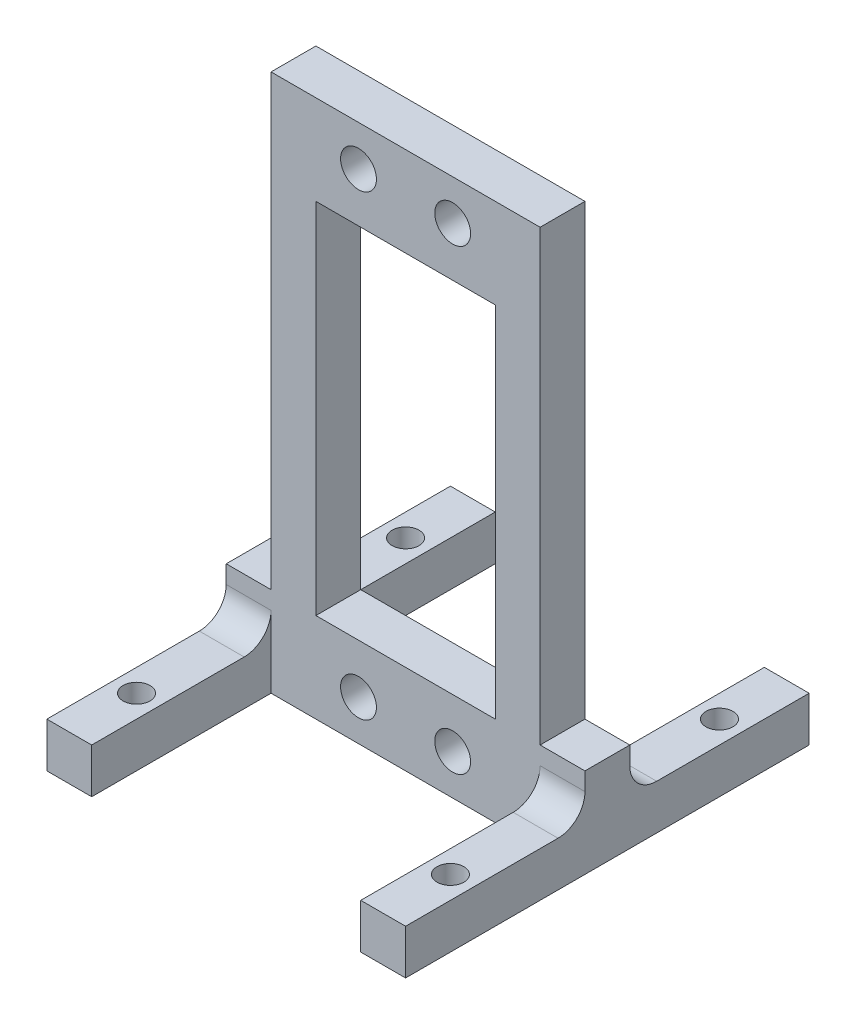
ISO-10303-21;
HEADER;
FILE_DESCRIPTION(('STEP AP214'),'2;1');
FILE_NAME('part.step','',(''),(''),'','','');
FILE_SCHEMA(('AUTOMOTIVE_DESIGN { 1 0 10303 214 1 1 1 1 }'));
ENDSEC;
DATA;
#1=APPLICATION_CONTEXT('core data for automotive mechanical design processes');
#2=APPLICATION_PROTOCOL_DEFINITION('international standard','automotive_design',2000,#1);
#3=PRODUCT_CONTEXT('',#1,'mechanical');
#4=PRODUCT('Part','Part','',(#3));
#5=PRODUCT_RELATED_PRODUCT_CATEGORY('part','',(#4));
#6=PRODUCT_DEFINITION_FORMATION('','',#4);
#7=PRODUCT_DEFINITION_CONTEXT('part definition',#1,'design');
#8=PRODUCT_DEFINITION('design','',#6,#7);
#9=PRODUCT_DEFINITION_SHAPE('','',#8);
#10=(LENGTH_UNIT() NAMED_UNIT(*) SI_UNIT(.MILLI.,.METRE.));
#11=(NAMED_UNIT(*) PLANE_ANGLE_UNIT() SI_UNIT($,.RADIAN.));
#12=(NAMED_UNIT(*) SI_UNIT($,.STERADIAN.) SOLID_ANGLE_UNIT());
#13=UNCERTAINTY_MEASURE_WITH_UNIT(LENGTH_MEASURE(1.E-05),#10,'distance_accuracy_value','');
#14=(GEOMETRIC_REPRESENTATION_CONTEXT(3) GLOBAL_UNCERTAINTY_ASSIGNED_CONTEXT((#13)) GLOBAL_UNIT_ASSIGNED_CONTEXT((#10,
#11,#12)) REPRESENTATION_CONTEXT('',''));
#15=CARTESIAN_POINT('',(0.,0.,0.));
#16=DIRECTION('',(0.,0.,1.));
#17=DIRECTION('',(1.,0.,0.));
#18=AXIS2_PLACEMENT_3D('',#15,#16,#17);
#19=CARTESIAN_POINT('',(25.,-50.,5.));
#20=DIRECTION('',(0.,1.,0.));
#21=DIRECTION('',(-1.,0.,0.));
#22=AXIS2_PLACEMENT_3D('',#19,#20,#21);
#23=PLANE('',#22);
#24=CARTESIAN_POINT('',(27.5,-50.,17.5));
#25=DIRECTION('',(0.,1.,0.));
#26=DIRECTION('',(0.,0.,1.));
#27=AXIS2_PLACEMENT_3D('',#24,#25,#26);
#28=CIRCLE('',#27,1.5);
#29=CARTESIAN_POINT('',(27.5,-50.,19.));
#30=VERTEX_POINT('',#29);
#31=EDGE_CURVE('E811',#30,#30,#28,.T.);
#32=ORIENTED_EDGE('',*,*,#31,.T.);
#33=EDGE_LOOP('',(#32));
#34=FACE_BOUND('',#33,.T.);
#35=CARTESIAN_POINT('',(27.5,-50.,-12.5));
#36=DIRECTION('',(0.,1.,0.));
#37=DIRECTION('',(0.,0.,1.));
#38=AXIS2_PLACEMENT_3D('',#35,#36,#37);
#39=CIRCLE('',#38,1.5);
#40=CARTESIAN_POINT('',(27.5,-50.,-11.));
#41=VERTEX_POINT('',#40);
#42=EDGE_CURVE('E279',#41,#41,#39,.F.);
#43=ORIENTED_EDGE('',*,*,#42,.F.);
#44=EDGE_LOOP('',(#43));
#45=FACE_BOUND('',#44,.T.);
#46=DIRECTION('',(1.,0.,0.));
#47=VECTOR('',#46,1.);
#48=CARTESIAN_POINT('',(25.,-50.,0.));
#49=LINE('',#48,#47);
#50=CARTESIAN_POINT('',(-5.,-50.,0.));
#51=VERTEX_POINT('',#50);
#52=CARTESIAN_POINT('',(25.,-50.,0.));
#53=VERTEX_POINT('',#52);
#54=EDGE_CURVE('E452',#51,#53,#49,.T.);
#55=ORIENTED_EDGE('',*,*,#54,.T.);
#56=DIRECTION('',(0.,0.,-1.));
#57=VECTOR('',#56,1.);
#58=CARTESIAN_POINT('',(25.,-50.,0.));
#59=LINE('',#58,#57);
#60=CARTESIAN_POINT('',(25.,-50.,-20.));
#61=VERTEX_POINT('',#60);
#62=EDGE_CURVE('E237',#53,#61,#59,.T.);
#63=ORIENTED_EDGE('',*,*,#62,.T.);
#64=DIRECTION('',(-1.,0.,0.));
#65=VECTOR('',#64,1.);
#66=CARTESIAN_POINT('',(30.,-50.,-20.));
#67=LINE('',#66,#65);
#68=CARTESIAN_POINT('',(30.,-50.,-20.));
#69=VERTEX_POINT('',#68);
#70=EDGE_CURVE('E380',#69,#61,#67,.T.);
#71=ORIENTED_EDGE('',*,*,#70,.F.);
#72=DIRECTION('',(0.,0.,-1.));
#73=VECTOR('',#72,1.);
#74=CARTESIAN_POINT('',(30.,-50.,5.));
#75=LINE('',#74,#73);
#76=CARTESIAN_POINT('',(30.,-50.,25.));
#77=VERTEX_POINT('',#76);
#78=EDGE_CURVE('E314',#77,#69,#75,.T.);
#79=ORIENTED_EDGE('',*,*,#78,.F.);
#80=DIRECTION('',(-1.,0.,0.));
#81=VECTOR('',#80,1.);
#82=CARTESIAN_POINT('',(30.,-50.,25.));
#83=LINE('',#82,#81);
#84=CARTESIAN_POINT('',(25.,-50.,25.));
#85=VERTEX_POINT('',#84);
#86=EDGE_CURVE('E335',#77,#85,#83,.T.);
#87=ORIENTED_EDGE('',*,*,#86,.T.);
#88=CARTESIAN_POINT('',(25.,-50.,5.));
#89=VERTEX_POINT('',#88);
#90=EDGE_CURVE('E336',#85,#89,#59,.T.);
#91=ORIENTED_EDGE('',*,*,#90,.T.);
#92=DIRECTION('',(1.,0.,0.));
#93=VECTOR('',#92,1.);
#94=CARTESIAN_POINT('',(25.,-50.,5.));
#95=LINE('',#94,#93);
#96=CARTESIAN_POINT('',(-5.,-50.,5.));
#97=VERTEX_POINT('',#96);
#98=EDGE_CURVE('E442',#97,#89,#95,.T.);
#99=ORIENTED_EDGE('',*,*,#98,.F.);
#100=DIRECTION('',(0.,0.,-1.));
#101=VECTOR('',#100,1.);
#102=CARTESIAN_POINT('',(-5.,-50.,5.));
#103=LINE('',#102,#101);
#104=CARTESIAN_POINT('',(-5.,-50.,25.));
#105=VERTEX_POINT('',#104);
#106=EDGE_CURVE('E232',#105,#97,#103,.T.);
#107=ORIENTED_EDGE('',*,*,#106,.F.);
#108=DIRECTION('',(1.,0.,0.));
#109=VECTOR('',#108,1.);
#110=CARTESIAN_POINT('',(-10.,-50.,25.));
#111=LINE('',#110,#109);
#112=CARTESIAN_POINT('',(-10.,-50.,25.));
#113=VERTEX_POINT('',#112);
#114=EDGE_CURVE('E225',#113,#105,#111,.T.);
#115=ORIENTED_EDGE('',*,*,#114,.F.);
#116=DIRECTION('',(0.,0.,-1.));
#117=VECTOR('',#116,1.);
#118=CARTESIAN_POINT('',(-10.,-50.,5.));
#119=LINE('',#118,#117);
#120=CARTESIAN_POINT('',(-10.,-50.,-20.));
#121=VERTEX_POINT('',#120);
#122=EDGE_CURVE('E229',#113,#121,#119,.T.);
#123=ORIENTED_EDGE('',*,*,#122,.T.);
#124=DIRECTION('',(1.,0.,0.));
#125=VECTOR('',#124,1.);
#126=CARTESIAN_POINT('',(-10.,-50.,-20.));
#127=LINE('',#126,#125);
#128=CARTESIAN_POINT('',(-5.,-50.,-20.));
#129=VERTEX_POINT('',#128);
#130=EDGE_CURVE('E275',#121,#129,#127,.T.);
#131=ORIENTED_EDGE('',*,*,#130,.T.);
#132=EDGE_CURVE('E296',#51,#129,#103,.T.);
#133=ORIENTED_EDGE('',*,*,#132,.F.);
#134=EDGE_LOOP('',(#55,#63,#71,#79,#87,#91,#99,#107,#115,#123,#131,#133));
#135=FACE_BOUND('',#134,.T.);
#136=CARTESIAN_POINT('',(-7.5,-50.,17.5));
#137=DIRECTION('',(0.,1.,0.));
#138=DIRECTION('',(0.,0.,1.));
#139=AXIS2_PLACEMENT_3D('',#136,#137,#138);
#140=CIRCLE('',#139,1.5);
#141=CARTESIAN_POINT('',(-7.5,-50.,19.));
#142=VERTEX_POINT('',#141);
#143=EDGE_CURVE('E820',#142,#142,#140,.F.);
#144=ORIENTED_EDGE('',*,*,#143,.F.);
#145=EDGE_LOOP('',(#144));
#146=FACE_BOUND('',#145,.T.);
#147=CARTESIAN_POINT('',(-7.5,-50.,-12.5));
#148=DIRECTION('',(0.,1.,0.));
#149=DIRECTION('',(0.,0.,1.));
#150=AXIS2_PLACEMENT_3D('',#147,#148,#149);
#151=CIRCLE('',#150,1.5);
#152=CARTESIAN_POINT('',(-7.5,-50.,-11.));
#153=VERTEX_POINT('',#152);
#154=EDGE_CURVE('E814',#153,#153,#151,.T.);
#155=ORIENTED_EDGE('',*,*,#154,.T.);
#156=EDGE_LOOP('',(#155));
#157=FACE_BOUND('',#156,.T.);
#158=ADVANCED_FACE('F39',(#34,#45,#135,#146,#157),#23,.F.);
#159=CARTESIAN_POINT('',(-5.,-50.,5.));
#160=DIRECTION('',(1.,0.,0.));
#161=DIRECTION('',(0.,0.,-1.));
#162=AXIS2_PLACEMENT_3D('',#159,#160,#161);
#163=PLANE('',#162);
#164=DIRECTION('',(0.,-1.,0.));
#165=VECTOR('',#164,1.);
#166=CARTESIAN_POINT('',(-5.,-50.,0.));
#167=LINE('',#166,#165);
#168=CARTESIAN_POINT('',(-5.,10.,0.));
#169=VERTEX_POINT('',#168);
#170=CARTESIAN_POINT('',(-5.,-40.,0.));
#171=VERTEX_POINT('',#170);
#172=EDGE_CURVE('E449',#169,#171,#167,.T.);
#173=ORIENTED_EDGE('',*,*,#172,.T.);
#174=DIRECTION('',(0.,0.,1.));
#175=VECTOR('',#174,1.);
#176=CARTESIAN_POINT('',(-5.,-40.,5.));
#177=LINE('',#176,#175);
#178=CARTESIAN_POINT('',(-5.,-40.,5.));
#179=VERTEX_POINT('',#178);
#180=EDGE_CURVE('E285',#171,#179,#177,.T.);
#181=ORIENTED_EDGE('',*,*,#180,.T.);
#182=DIRECTION('',(0.,-1.,0.));
#183=VECTOR('',#182,1.);
#184=CARTESIAN_POINT('',(-5.,-50.,5.));
#185=LINE('',#184,#183);
#186=CARTESIAN_POINT('',(-5.,10.,5.));
#187=VERTEX_POINT('',#186);
#188=EDGE_CURVE('E439',#187,#179,#185,.T.);
#189=ORIENTED_EDGE('',*,*,#188,.F.);
#190=DIRECTION('',(0.,0.,-1.));
#191=VECTOR('',#190,1.);
#192=CARTESIAN_POINT('',(-5.,10.,5.));
#193=LINE('',#192,#191);
#194=EDGE_CURVE('E47',#187,#169,#193,.T.);
#195=ORIENTED_EDGE('',*,*,#194,.T.);
#196=EDGE_LOOP('',(#173,#181,#189,#195));
#197=FACE_BOUND('',#196,.T.);
#198=ADVANCED_FACE('F41',(#197),#163,.F.);
#199=CARTESIAN_POINT('',(25.,10.,5.));
#200=DIRECTION('',(-1.,0.,0.));
#201=DIRECTION('',(0.,0.,1.));
#202=AXIS2_PLACEMENT_3D('',#199,#200,#201);
#203=PLANE('',#202);
#204=DIRECTION('',(0.,0.,1.));
#205=VECTOR('',#204,1.);
#206=CARTESIAN_POINT('',(25.,-40.,5.));
#207=LINE('',#206,#205);
#208=CARTESIAN_POINT('',(25.,-40.,0.));
#209=VERTEX_POINT('',#208);
#210=CARTESIAN_POINT('',(25.,-40.,5.));
#211=VERTEX_POINT('',#210);
#212=EDGE_CURVE('E346',#209,#211,#207,.T.);
#213=ORIENTED_EDGE('',*,*,#212,.F.);
#214=DIRECTION('',(0.,1.,0.));
#215=VECTOR('',#214,1.);
#216=CARTESIAN_POINT('',(25.,10.,0.));
#217=LINE('',#216,#215);
#218=CARTESIAN_POINT('',(25.,10.,0.));
#219=VERTEX_POINT('',#218);
#220=EDGE_CURVE('E454',#209,#219,#217,.T.);
#221=ORIENTED_EDGE('',*,*,#220,.T.);
#222=DIRECTION('',(0.,0.,-1.));
#223=VECTOR('',#222,1.);
#224=CARTESIAN_POINT('',(25.,10.,5.));
#225=LINE('',#224,#223);
#226=CARTESIAN_POINT('',(25.,10.,5.));
#227=VERTEX_POINT('',#226);
#228=EDGE_CURVE('E12',#227,#219,#225,.T.);
#229=ORIENTED_EDGE('',*,*,#228,.F.);
#230=DIRECTION('',(0.,1.,0.));
#231=VECTOR('',#230,1.);
#232=CARTESIAN_POINT('',(25.,10.,5.));
#233=LINE('',#232,#231);
#234=EDGE_CURVE('E445',#211,#227,#233,.T.);
#235=ORIENTED_EDGE('',*,*,#234,.F.);
#236=EDGE_LOOP('',(#213,#221,#229,#235));
#237=FACE_BOUND('',#236,.T.);
#238=ADVANCED_FACE('F479',(#237),#203,.F.);
#239=CARTESIAN_POINT('',(0.,0.,5.));
#240=DIRECTION('',(0.,0.,-1.));
#241=DIRECTION('',(-1.,0.,0.));
#242=AXIS2_PLACEMENT_3D('',#239,#240,#241);
#243=PLANE('',#242);
#244=CARTESIAN_POINT('',(15.25,5.49999999999999,5.));
#245=DIRECTION('',(0.,0.,1.));
#246=DIRECTION('',(1.,0.,0.));
#247=AXIS2_PLACEMENT_3D('',#244,#245,#246);
#248=CIRCLE('',#247,2.);
#249=CARTESIAN_POINT('',(17.25,5.49999999999999,5.));
#250=VERTEX_POINT('',#249);
#251=EDGE_CURVE('E388',#250,#250,#248,.T.);
#252=ORIENTED_EDGE('',*,*,#251,.F.);
#253=EDGE_LOOP('',(#252));
#254=FACE_BOUND('',#253,.T.);
#255=CARTESIAN_POINT('',(4.75,5.5,5.));
#256=DIRECTION('',(0.,0.,1.));
#257=DIRECTION('',(1.,0.,0.));
#258=AXIS2_PLACEMENT_3D('',#255,#256,#257);
#259=CIRCLE('',#258,2.);
#260=CARTESIAN_POINT('',(6.75,5.5,5.));
#261=VERTEX_POINT('',#260);
#262=EDGE_CURVE('E387',#261,#261,#259,.F.);
#263=ORIENTED_EDGE('',*,*,#262,.T.);
#264=EDGE_LOOP('',(#263));
#265=FACE_BOUND('',#264,.T.);
#266=ORIENTED_EDGE('',*,*,#188,.T.);
#267=DIRECTION('',(1.,0.,0.));
#268=VECTOR('',#267,1.);
#269=CARTESIAN_POINT('',(-10.,-40.,5.));
#270=LINE('',#269,#268);
#271=CARTESIAN_POINT('',(-10.,-40.,5.));
#272=VERTEX_POINT('',#271);
#273=EDGE_CURVE('E54',#272,#179,#270,.T.);
#274=ORIENTED_EDGE('',*,*,#273,.F.);
#275=DIRECTION('',(0.,-1.,0.));
#276=VECTOR('',#275,1.);
#277=CARTESIAN_POINT('',(-10.,-42.,5.));
#278=LINE('',#277,#276);
#279=CARTESIAN_POINT('',(-10.,-42.,5.));
#280=VERTEX_POINT('',#279);
#281=EDGE_CURVE('E260',#272,#280,#278,.T.);
#282=ORIENTED_EDGE('',*,*,#281,.T.);
#283=DIRECTION('',(1.,0.,0.));
#284=VECTOR('',#283,1.);
#285=CARTESIAN_POINT('',(-10.,-42.,5.));
#286=LINE('',#285,#284);
#287=CARTESIAN_POINT('',(-5.,-42.,5.));
#288=VERTEX_POINT('',#287);
#289=EDGE_CURVE('E308',#280,#288,#286,.T.);
#290=ORIENTED_EDGE('',*,*,#289,.T.);
#291=EDGE_CURVE('E443',#288,#97,#185,.T.);
#292=ORIENTED_EDGE('',*,*,#291,.T.);
#293=ORIENTED_EDGE('',*,*,#98,.T.);
#294=CARTESIAN_POINT('',(25.,-42.,5.));
#295=VERTEX_POINT('',#294);
#296=EDGE_CURVE('E62',#89,#295,#233,.T.);
#297=ORIENTED_EDGE('',*,*,#296,.T.);
#298=DIRECTION('',(-1.,0.,0.));
#299=VECTOR('',#298,1.);
#300=CARTESIAN_POINT('',(30.,-42.,5.));
#301=LINE('',#300,#299);
#302=CARTESIAN_POINT('',(30.,-42.,5.));
#303=VERTEX_POINT('',#302);
#304=EDGE_CURVE('E363',#303,#295,#301,.T.);
#305=ORIENTED_EDGE('',*,*,#304,.F.);
#306=DIRECTION('',(0.,-1.,0.));
#307=VECTOR('',#306,1.);
#308=CARTESIAN_POINT('',(30.,-42.,5.));
#309=LINE('',#308,#307);
#310=CARTESIAN_POINT('',(30.,-40.,5.));
#311=VERTEX_POINT('',#310);
#312=EDGE_CURVE('E327',#311,#303,#309,.T.);
#313=ORIENTED_EDGE('',*,*,#312,.F.);
#314=DIRECTION('',(-1.,0.,0.));
#315=VECTOR('',#314,1.);
#316=CARTESIAN_POINT('',(30.,-40.,5.));
#317=LINE('',#316,#315);
#318=EDGE_CURVE('E365',#311,#211,#317,.T.);
#319=ORIENTED_EDGE('',*,*,#318,.T.);
#320=ORIENTED_EDGE('',*,*,#234,.T.);
#321=DIRECTION('',(-1.,0.,0.));
#322=VECTOR('',#321,1.);
#323=CARTESIAN_POINT('',(-5.,10.,5.));
#324=LINE('',#323,#322);
#325=EDGE_CURVE('E447',#227,#187,#324,.T.);
#326=ORIENTED_EDGE('',*,*,#325,.T.);
#327=EDGE_LOOP('',(#266,#274,#282,#290,#292,#293,#297,#305,#313,#319,#320,#326));
#328=FACE_BOUND('',#327,.T.);
#329=DIRECTION('',(0.,-1.,0.));
#330=VECTOR('',#329,1.);
#331=CARTESIAN_POINT('',(0.,0.,5.));
#332=LINE('',#331,#330);
#333=CARTESIAN_POINT('',(0.,0.,5.));
#334=VERTEX_POINT('',#333);
#335=CARTESIAN_POINT('',(0.,-40.,5.));
#336=VERTEX_POINT('',#335);
#337=EDGE_CURVE('E408',#334,#336,#332,.T.);
#338=ORIENTED_EDGE('',*,*,#337,.F.);
#339=DIRECTION('',(-1.,0.,0.));
#340=VECTOR('',#339,1.);
#341=CARTESIAN_POINT('',(0.,0.,5.));
#342=LINE('',#341,#340);
#343=CARTESIAN_POINT('',(20.,0.,5.));
#344=VERTEX_POINT('',#343);
#345=EDGE_CURVE('E416',#344,#334,#342,.T.);
#346=ORIENTED_EDGE('',*,*,#345,.F.);
#347=DIRECTION('',(0.,1.,0.));
#348=VECTOR('',#347,1.);
#349=CARTESIAN_POINT('',(20.,0.,5.));
#350=LINE('',#349,#348);
#351=CARTESIAN_POINT('',(20.,-40.,5.));
#352=VERTEX_POINT('',#351);
#353=EDGE_CURVE('E413',#352,#344,#350,.T.);
#354=ORIENTED_EDGE('',*,*,#353,.F.);
#355=DIRECTION('',(1.,0.,0.));
#356=VECTOR('',#355,1.);
#357=CARTESIAN_POINT('',(0.,-40.,5.));
#358=LINE('',#357,#356);
#359=EDGE_CURVE('E410',#336,#352,#358,.T.);
#360=ORIENTED_EDGE('',*,*,#359,.F.);
#361=EDGE_LOOP('',(#338,#346,#354,#360));
#362=FACE_BOUND('',#361,.T.);
#363=CARTESIAN_POINT('',(15.25,-45.5,5.));
#364=DIRECTION('',(0.,0.,1.));
#365=DIRECTION('',(1.,0.,0.));
#366=AXIS2_PLACEMENT_3D('',#363,#364,#365);
#367=CIRCLE('',#366,1.99999999999994);
#368=CARTESIAN_POINT('',(17.2499999999999,-45.5,5.));
#369=VERTEX_POINT('',#368);
#370=EDGE_CURVE('E394',#369,#369,#367,.F.);
#371=ORIENTED_EDGE('',*,*,#370,.T.);
#372=EDGE_LOOP('',(#371));
#373=FACE_BOUND('',#372,.T.);
#374=CARTESIAN_POINT('',(4.74999999999999,-45.5,5.));
#375=DIRECTION('',(0.,0.,1.));
#376=DIRECTION('',(1.,0.,0.));
#377=AXIS2_PLACEMENT_3D('',#374,#375,#376);
#378=CIRCLE('',#377,1.99999999999994);
#379=CARTESIAN_POINT('',(6.74999999999993,-45.5,5.));
#380=VERTEX_POINT('',#379);
#381=EDGE_CURVE('E383',#380,#380,#378,.T.);
#382=ORIENTED_EDGE('',*,*,#381,.F.);
#383=EDGE_LOOP('',(#382));
#384=FACE_BOUND('',#383,.T.);
#385=ADVANCED_FACE('F473',(#254,#265,#328,#362,#373,#384),#243,.F.);
#386=CARTESIAN_POINT('',(0.,0.,0.));
#387=DIRECTION('',(0.,0.,-1.));
#388=DIRECTION('',(-1.,0.,0.));
#389=AXIS2_PLACEMENT_3D('',#386,#387,#388);
#390=PLANE('',#389);
#391=CARTESIAN_POINT('',(15.25,-45.5,0.));
#392=DIRECTION('',(0.,0.,1.));
#393=DIRECTION('',(1.,0.,0.));
#394=AXIS2_PLACEMENT_3D('',#391,#392,#393);
#395=CIRCLE('',#394,1.99999999999994);
#396=CARTESIAN_POINT('',(17.2499999999999,-45.5,0.));
#397=VERTEX_POINT('',#396);
#398=EDGE_CURVE('E391',#397,#397,#395,.F.);
#399=ORIENTED_EDGE('',*,*,#398,.F.);
#400=EDGE_LOOP('',(#399));
#401=FACE_BOUND('',#400,.T.);
#402=CARTESIAN_POINT('',(4.75,5.5,0.));
#403=DIRECTION('',(0.,0.,1.));
#404=DIRECTION('',(1.,0.,0.));
#405=AXIS2_PLACEMENT_3D('',#402,#403,#404);
#406=CIRCLE('',#405,2.);
#407=CARTESIAN_POINT('',(6.75,5.5,0.));
#408=VERTEX_POINT('',#407);
#409=EDGE_CURVE('E402',#408,#408,#406,.F.);
#410=ORIENTED_EDGE('',*,*,#409,.F.);
#411=EDGE_LOOP('',(#410));
#412=FACE_BOUND('',#411,.T.);
#413=ORIENTED_EDGE('',*,*,#172,.F.);
#414=DIRECTION('',(-1.,0.,0.));
#415=VECTOR('',#414,1.);
#416=CARTESIAN_POINT('',(-5.,10.,0.));
#417=LINE('',#416,#415);
#418=EDGE_CURVE('E457',#219,#169,#417,.T.);
#419=ORIENTED_EDGE('',*,*,#418,.F.);
#420=ORIENTED_EDGE('',*,*,#220,.F.);
#421=DIRECTION('',(-1.,0.,0.));
#422=VECTOR('',#421,1.);
#423=CARTESIAN_POINT('',(30.,-40.,0.));
#424=LINE('',#423,#422);
#425=CARTESIAN_POINT('',(30.,-40.,0.));
#426=VERTEX_POINT('',#425);
#427=EDGE_CURVE('E368',#426,#209,#424,.T.);
#428=ORIENTED_EDGE('',*,*,#427,.F.);
#429=DIRECTION('',(0.,1.,0.));
#430=VECTOR('',#429,1.);
#431=CARTESIAN_POINT('',(30.,-42.,0.));
#432=LINE('',#431,#430);
#433=CARTESIAN_POINT('',(30.,-42.,0.));
#434=VERTEX_POINT('',#433);
#435=EDGE_CURVE('E323',#434,#426,#432,.T.);
#436=ORIENTED_EDGE('',*,*,#435,.F.);
#437=DIRECTION('',(-1.,0.,0.));
#438=VECTOR('',#437,1.);
#439=CARTESIAN_POINT('',(30.,-42.,0.));
#440=LINE('',#439,#438);
#441=CARTESIAN_POINT('',(25.,-42.,0.));
#442=VERTEX_POINT('',#441);
#443=EDGE_CURVE('E371',#434,#442,#440,.T.);
#444=ORIENTED_EDGE('',*,*,#443,.T.);
#445=EDGE_CURVE('E455',#53,#442,#217,.T.);
#446=ORIENTED_EDGE('',*,*,#445,.F.);
#447=ORIENTED_EDGE('',*,*,#54,.F.);
#448=CARTESIAN_POINT('',(-5.,-42.,0.));
#449=VERTEX_POINT('',#448);
#450=EDGE_CURVE('E438',#449,#51,#167,.T.);
#451=ORIENTED_EDGE('',*,*,#450,.F.);
#452=DIRECTION('',(1.,0.,0.));
#453=VECTOR('',#452,1.);
#454=CARTESIAN_POINT('',(-10.,-42.,0.));
#455=LINE('',#454,#453);
#456=CARTESIAN_POINT('',(-10.,-42.,0.));
#457=VERTEX_POINT('',#456);
#458=EDGE_CURVE('E303',#457,#449,#455,.T.);
#459=ORIENTED_EDGE('',*,*,#458,.F.);
#460=DIRECTION('',(0.,1.,0.));
#461=VECTOR('',#460,1.);
#462=CARTESIAN_POINT('',(-10.,-42.,0.));
#463=LINE('',#462,#461);
#464=CARTESIAN_POINT('',(-10.,-40.,0.));
#465=VERTEX_POINT('',#464);
#466=EDGE_CURVE('E265',#457,#465,#463,.T.);
#467=ORIENTED_EDGE('',*,*,#466,.T.);
#468=DIRECTION('',(1.,0.,0.));
#469=VECTOR('',#468,1.);
#470=CARTESIAN_POINT('',(-10.,-40.,0.));
#471=LINE('',#470,#469);
#472=EDGE_CURVE('E305',#465,#171,#471,.T.);
#473=ORIENTED_EDGE('',*,*,#472,.T.);
#474=EDGE_LOOP('',(#413,#419,#420,#428,#436,#444,#446,#447,#451,#459,#467,#473));
#475=FACE_BOUND('',#474,.T.);
#476=DIRECTION('',(-1.,0.,0.));
#477=VECTOR('',#476,1.);
#478=CARTESIAN_POINT('',(0.,0.,0.));
#479=LINE('',#478,#477);
#480=CARTESIAN_POINT('',(20.,0.,0.));
#481=VERTEX_POINT('',#480);
#482=CARTESIAN_POINT('',(0.,0.,0.));
#483=VERTEX_POINT('',#482);
#484=EDGE_CURVE('E411',#481,#483,#479,.T.);
#485=ORIENTED_EDGE('',*,*,#484,.T.);
#486=DIRECTION('',(0.,-1.,0.));
#487=VECTOR('',#486,1.);
#488=CARTESIAN_POINT('',(0.,0.,0.));
#489=LINE('',#488,#487);
#490=CARTESIAN_POINT('',(0.,-40.,0.));
#491=VERTEX_POINT('',#490);
#492=EDGE_CURVE('E405',#483,#491,#489,.T.);
#493=ORIENTED_EDGE('',*,*,#492,.T.);
#494=DIRECTION('',(1.,0.,0.));
#495=VECTOR('',#494,1.);
#496=CARTESIAN_POINT('',(0.,-40.,0.));
#497=LINE('',#496,#495);
#498=CARTESIAN_POINT('',(20.,-40.,0.));
#499=VERTEX_POINT('',#498);
#500=EDGE_CURVE('E421',#491,#499,#497,.T.);
#501=ORIENTED_EDGE('',*,*,#500,.T.);
#502=DIRECTION('',(0.,1.,0.));
#503=VECTOR('',#502,1.);
#504=CARTESIAN_POINT('',(20.,0.,0.));
#505=LINE('',#504,#503);
#506=EDGE_CURVE('E424',#499,#481,#505,.T.);
#507=ORIENTED_EDGE('',*,*,#506,.T.);
#508=EDGE_LOOP('',(#485,#493,#501,#507));
#509=FACE_BOUND('',#508,.T.);
#510=CARTESIAN_POINT('',(15.25,5.49999999999999,0.));
#511=DIRECTION('',(0.,0.,1.));
#512=DIRECTION('',(1.,0.,0.));
#513=AXIS2_PLACEMENT_3D('',#510,#511,#512);
#514=CIRCLE('',#513,2.);
#515=CARTESIAN_POINT('',(17.25,5.49999999999999,0.));
#516=VERTEX_POINT('',#515);
#517=EDGE_CURVE('E384',#516,#516,#514,.T.);
#518=ORIENTED_EDGE('',*,*,#517,.T.);
#519=EDGE_LOOP('',(#518));
#520=FACE_BOUND('',#519,.T.);
#521=CARTESIAN_POINT('',(4.74999999999999,-45.5,0.));
#522=DIRECTION('',(0.,0.,1.));
#523=DIRECTION('',(1.,0.,0.));
#524=AXIS2_PLACEMENT_3D('',#521,#522,#523);
#525=CIRCLE('',#524,1.99999999999994);
#526=CARTESIAN_POINT('',(6.74999999999993,-45.5,0.));
#527=VERTEX_POINT('',#526);
#528=EDGE_CURVE('E397',#527,#527,#525,.T.);
#529=ORIENTED_EDGE('',*,*,#528,.T.);
#530=EDGE_LOOP('',(#529));
#531=FACE_BOUND('',#530,.T.);
#532=ADVANCED_FACE('F467',(#401,#412,#475,#509,#520,#531),#390,.T.);
#533=CARTESIAN_POINT('',(-5.,10.,5.));
#534=DIRECTION('',(0.,-1.,0.));
#535=DIRECTION('',(0.,0.,-1.));
#536=AXIS2_PLACEMENT_3D('',#533,#534,#535);
#537=PLANE('',#536);
#538=ORIENTED_EDGE('',*,*,#418,.T.);
#539=ORIENTED_EDGE('',*,*,#194,.F.);
#540=ORIENTED_EDGE('',*,*,#325,.F.);
#541=ORIENTED_EDGE('',*,*,#228,.T.);
#542=EDGE_LOOP('',(#538,#539,#540,#541));
#543=FACE_BOUND('',#542,.T.);
#544=ADVANCED_FACE('F477',(#543),#537,.F.);
#545=CARTESIAN_POINT('',(0.,0.,5.));
#546=DIRECTION('',(1.,0.,0.));
#547=DIRECTION('',(0.,1.,0.));
#548=AXIS2_PLACEMENT_3D('',#545,#546,#547);
#549=PLANE('',#548);
#550=ORIENTED_EDGE('',*,*,#492,.F.);
#551=DIRECTION('',(0.,0.,-1.));
#552=VECTOR('',#551,1.);
#553=CARTESIAN_POINT('',(0.,0.,5.));
#554=LINE('',#553,#552);
#555=EDGE_CURVE('E418',#334,#483,#554,.T.);
#556=ORIENTED_EDGE('',*,*,#555,.F.);
#557=ORIENTED_EDGE('',*,*,#337,.T.);
#558=DIRECTION('',(0.,0.,-1.));
#559=VECTOR('',#558,1.);
#560=CARTESIAN_POINT('',(0.,-40.,5.));
#561=LINE('',#560,#559);
#562=EDGE_CURVE('E435',#336,#491,#561,.T.);
#563=ORIENTED_EDGE('',*,*,#562,.T.);
#564=EDGE_LOOP('',(#550,#556,#557,#563));
#565=FACE_BOUND('',#564,.T.);
#566=ADVANCED_FACE('F549',(#565),#549,.T.);
#567=CARTESIAN_POINT('',(0.,-40.,5.));
#568=DIRECTION('',(0.,1.,0.));
#569=DIRECTION('',(0.,0.,1.));
#570=AXIS2_PLACEMENT_3D('',#567,#568,#569);
#571=PLANE('',#570);
#572=ORIENTED_EDGE('',*,*,#500,.F.);
#573=ORIENTED_EDGE('',*,*,#562,.F.);
#574=ORIENTED_EDGE('',*,*,#359,.T.);
#575=DIRECTION('',(0.,0.,-1.));
#576=VECTOR('',#575,1.);
#577=CARTESIAN_POINT('',(20.,-40.,5.));
#578=LINE('',#577,#576);
#579=EDGE_CURVE('E433',#352,#499,#578,.T.);
#580=ORIENTED_EDGE('',*,*,#579,.T.);
#581=EDGE_LOOP('',(#572,#573,#574,#580));
#582=FACE_BOUND('',#581,.T.);
#583=ADVANCED_FACE('F558',(#582),#571,.T.);
#584=CARTESIAN_POINT('',(20.,0.,5.));
#585=DIRECTION('',(-1.,0.,0.));
#586=DIRECTION('',(0.,-1.,0.));
#587=AXIS2_PLACEMENT_3D('',#584,#585,#586);
#588=PLANE('',#587);
#589=ORIENTED_EDGE('',*,*,#506,.F.);
#590=ORIENTED_EDGE('',*,*,#579,.F.);
#591=ORIENTED_EDGE('',*,*,#353,.T.);
#592=DIRECTION('',(0.,0.,-1.));
#593=VECTOR('',#592,1.);
#594=CARTESIAN_POINT('',(20.,0.,5.));
#595=LINE('',#594,#593);
#596=EDGE_CURVE('E431',#344,#481,#595,.T.);
#597=ORIENTED_EDGE('',*,*,#596,.T.);
#598=EDGE_LOOP('',(#589,#590,#591,#597));
#599=FACE_BOUND('',#598,.T.);
#600=ADVANCED_FACE('F562',(#599),#588,.T.);
#601=CARTESIAN_POINT('',(0.,0.,5.));
#602=DIRECTION('',(0.,-1.,0.));
#603=DIRECTION('',(0.,0.,-1.));
#604=AXIS2_PLACEMENT_3D('',#601,#602,#603);
#605=PLANE('',#604);
#606=ORIENTED_EDGE('',*,*,#484,.F.);
#607=ORIENTED_EDGE('',*,*,#596,.F.);
#608=ORIENTED_EDGE('',*,*,#345,.T.);
#609=ORIENTED_EDGE('',*,*,#555,.T.);
#610=EDGE_LOOP('',(#606,#607,#608,#609));
#611=FACE_BOUND('',#610,.T.);
#612=ADVANCED_FACE('F566',(#611),#605,.T.);
#613=CARTESIAN_POINT('',(4.75,5.5,0.));
#614=DIRECTION('',(0.,0.,1.));
#615=DIRECTION('',(1.,0.,0.));
#616=AXIS2_PLACEMENT_3D('',#613,#614,#615);
#617=CYLINDRICAL_SURFACE('',#616,2.);
#618=ORIENTED_EDGE('',*,*,#409,.T.);
#619=EDGE_LOOP('',(#618));
#620=FACE_BOUND('',#619,.T.);
#621=ORIENTED_EDGE('',*,*,#262,.F.);
#622=EDGE_LOOP('',(#621));
#623=FACE_BOUND('',#622,.T.);
#624=ADVANCED_FACE('F570',(#620,#623),#617,.F.);
#625=CARTESIAN_POINT('',(15.25,5.49999999999999,0.));
#626=DIRECTION('',(0.,0.,1.));
#627=DIRECTION('',(1.,0.,0.));
#628=AXIS2_PLACEMENT_3D('',#625,#626,#627);
#629=CYLINDRICAL_SURFACE('',#628,2.);
#630=ORIENTED_EDGE('',*,*,#517,.F.);
#631=EDGE_LOOP('',(#630));
#632=FACE_BOUND('',#631,.T.);
#633=ORIENTED_EDGE('',*,*,#251,.T.);
#634=EDGE_LOOP('',(#633));
#635=FACE_BOUND('',#634,.T.);
#636=ADVANCED_FACE('F574',(#632,#635),#629,.F.);
#637=CARTESIAN_POINT('',(15.25,-45.5,0.));
#638=DIRECTION('',(0.,0.,1.));
#639=DIRECTION('',(1.,0.,0.));
#640=AXIS2_PLACEMENT_3D('',#637,#638,#639);
#641=CYLINDRICAL_SURFACE('',#640,1.99999999999994);
#642=ORIENTED_EDGE('',*,*,#398,.T.);
#643=EDGE_LOOP('',(#642));
#644=FACE_BOUND('',#643,.T.);
#645=ORIENTED_EDGE('',*,*,#370,.F.);
#646=EDGE_LOOP('',(#645));
#647=FACE_BOUND('',#646,.T.);
#648=ADVANCED_FACE('F579',(#644,#647),#641,.F.);
#649=CARTESIAN_POINT('',(4.74999999999999,-45.5,0.));
#650=DIRECTION('',(0.,0.,1.));
#651=DIRECTION('',(1.,0.,0.));
#652=AXIS2_PLACEMENT_3D('',#649,#650,#651);
#653=CYLINDRICAL_SURFACE('',#652,1.99999999999994);
#654=ORIENTED_EDGE('',*,*,#528,.F.);
#655=EDGE_LOOP('',(#654));
#656=FACE_BOUND('',#655,.T.);
#657=ORIENTED_EDGE('',*,*,#381,.T.);
#658=EDGE_LOOP('',(#657));
#659=FACE_BOUND('',#658,.T.);
#660=ADVANCED_FACE('F576',(#656,#659),#653,.F.);
#661=CARTESIAN_POINT('',(25.,-42.,8.));
#662=DIRECTION('',(-1.,0.,0.));
#663=DIRECTION('',(0.,0.,1.));
#664=AXIS2_PLACEMENT_3D('',#661,#662,#663);
#665=PLANE('',#664);
#666=ORIENTED_EDGE('',*,*,#62,.F.);
#667=ORIENTED_EDGE('',*,*,#445,.T.);
#668=CARTESIAN_POINT('',(25.,-42.,-3.));
#669=DIRECTION('',(-1.,0.,0.));
#670=DIRECTION('',(0.,0.,1.));
#671=AXIS2_PLACEMENT_3D('',#668,#669,#670);
#672=CIRCLE('',#671,3.);
#673=CARTESIAN_POINT('',(25.,-45.,-3.00000000000002));
#674=VERTEX_POINT('',#673);
#675=EDGE_CURVE('E343',#674,#442,#672,.T.);
#676=ORIENTED_EDGE('',*,*,#675,.F.);
#677=DIRECTION('',(0.,0.,1.));
#678=VECTOR('',#677,1.);
#679=CARTESIAN_POINT('',(25.,-45.,-3.00000000000002));
#680=LINE('',#679,#678);
#681=CARTESIAN_POINT('',(25.,-45.,-20.));
#682=VERTEX_POINT('',#681);
#683=EDGE_CURVE('E341',#682,#674,#680,.T.);
#684=ORIENTED_EDGE('',*,*,#683,.F.);
#685=DIRECTION('',(0.,1.,0.));
#686=VECTOR('',#685,1.);
#687=CARTESIAN_POINT('',(25.,-45.,-20.));
#688=LINE('',#687,#686);
#689=EDGE_CURVE('E339',#61,#682,#688,.T.);
#690=ORIENTED_EDGE('',*,*,#689,.F.);
#691=EDGE_LOOP('',(#666,#667,#676,#684,#690));
#692=FACE_BOUND('',#691,.T.);
#693=ADVANCED_FACE('F500',(#692),#665,.T.);
#694=CARTESIAN_POINT('',(30.,-45.,-20.));
#695=DIRECTION('',(0.,0.,1.));
#696=DIRECTION('',(1.,0.,0.));
#697=AXIS2_PLACEMENT_3D('',#694,#695,#696);
#698=PLANE('',#697);
#699=ORIENTED_EDGE('',*,*,#689,.T.);
#700=DIRECTION('',(-1.,0.,0.));
#701=VECTOR('',#700,1.);
#702=CARTESIAN_POINT('',(30.,-45.,-20.));
#703=LINE('',#702,#701);
#704=CARTESIAN_POINT('',(30.,-45.,-20.));
#705=VERTEX_POINT('',#704);
#706=EDGE_CURVE('E377',#705,#682,#703,.T.);
#707=ORIENTED_EDGE('',*,*,#706,.F.);
#708=DIRECTION('',(0.,1.,0.));
#709=VECTOR('',#708,1.);
#710=CARTESIAN_POINT('',(30.,-45.,-20.));
#711=LINE('',#710,#709);
#712=EDGE_CURVE('E316',#69,#705,#711,.T.);
#713=ORIENTED_EDGE('',*,*,#712,.F.);
#714=ORIENTED_EDGE('',*,*,#70,.T.);
#715=EDGE_LOOP('',(#699,#707,#713,#714));
#716=FACE_BOUND('',#715,.T.);
#717=ADVANCED_FACE('F507',(#716),#698,.F.);
#718=CARTESIAN_POINT('',(30.,-45.,-3.00000000000002));
#719=DIRECTION('',(0.,-1.,0.));
#720=DIRECTION('',(0.,0.,-1.));
#721=AXIS2_PLACEMENT_3D('',#718,#719,#720);
#722=PLANE('',#721);
#723=CARTESIAN_POINT('',(27.5,-45.,-12.5));
#724=DIRECTION('',(0.,1.,0.));
#725=DIRECTION('',(0.,0.,1.));
#726=AXIS2_PLACEMENT_3D('',#723,#724,#725);
#727=CIRCLE('',#726,1.5);
#728=CARTESIAN_POINT('',(27.5,-45.,-11.));
#729=VERTEX_POINT('',#728);
#730=EDGE_CURVE('E807',#729,#729,#727,.F.);
#731=ORIENTED_EDGE('',*,*,#730,.T.);
#732=EDGE_LOOP('',(#731));
#733=FACE_BOUND('',#732,.T.);
#734=ORIENTED_EDGE('',*,*,#683,.T.);
#735=DIRECTION('',(-1.,0.,0.));
#736=VECTOR('',#735,1.);
#737=CARTESIAN_POINT('',(30.,-45.,-3.00000000000002));
#738=LINE('',#737,#736);
#739=CARTESIAN_POINT('',(30.,-45.,-3.00000000000002));
#740=VERTEX_POINT('',#739);
#741=EDGE_CURVE('E374',#740,#674,#738,.T.);
#742=ORIENTED_EDGE('',*,*,#741,.F.);
#743=DIRECTION('',(0.,0.,1.));
#744=VECTOR('',#743,1.);
#745=CARTESIAN_POINT('',(30.,-45.,-3.00000000000002));
#746=LINE('',#745,#744);
#747=EDGE_CURVE('E319',#705,#740,#746,.T.);
#748=ORIENTED_EDGE('',*,*,#747,.F.);
#749=ORIENTED_EDGE('',*,*,#706,.T.);
#750=EDGE_LOOP('',(#734,#742,#748,#749));
#751=FACE_BOUND('',#750,.T.);
#752=ADVANCED_FACE('F589',(#733,#751),#722,.F.);
#753=CARTESIAN_POINT('',(30.,-42.,-3.));
#754=DIRECTION('',(-1.,0.,0.));
#755=DIRECTION('',(0.,0.,1.));
#756=AXIS2_PLACEMENT_3D('',#753,#754,#755);
#757=CYLINDRICAL_SURFACE('',#756,3.);
#758=ORIENTED_EDGE('',*,*,#675,.T.);
#759=ORIENTED_EDGE('',*,*,#443,.F.);
#760=CARTESIAN_POINT('',(30.,-42.,-3.));
#761=DIRECTION('',(-1.,0.,0.));
#762=DIRECTION('',(0.,0.,1.));
#763=AXIS2_PLACEMENT_3D('',#760,#761,#762);
#764=CIRCLE('',#763,3.);
#765=EDGE_CURVE('E321',#740,#434,#764,.T.);
#766=ORIENTED_EDGE('',*,*,#765,.F.);
#767=ORIENTED_EDGE('',*,*,#741,.T.);
#768=EDGE_LOOP('',(#758,#759,#766,#767));
#769=FACE_BOUND('',#768,.T.);
#770=ADVANCED_FACE('F495',(#769),#757,.F.);
#771=CARTESIAN_POINT('',(30.,-40.,5.));
#772=DIRECTION('',(0.,-1.,0.));
#773=DIRECTION('',(0.,0.,-1.));
#774=AXIS2_PLACEMENT_3D('',#771,#772,#773);
#775=PLANE('',#774);
#776=ORIENTED_EDGE('',*,*,#212,.T.);
#777=ORIENTED_EDGE('',*,*,#318,.F.);
#778=DIRECTION('',(0.,0.,1.));
#779=VECTOR('',#778,1.);
#780=CARTESIAN_POINT('',(30.,-40.,5.));
#781=LINE('',#780,#779);
#782=EDGE_CURVE('E325',#426,#311,#781,.T.);
#783=ORIENTED_EDGE('',*,*,#782,.F.);
#784=ORIENTED_EDGE('',*,*,#427,.T.);
#785=EDGE_LOOP('',(#776,#777,#783,#784));
#786=FACE_BOUND('',#785,.T.);
#787=ADVANCED_FACE('F484',(#786),#775,.F.);
#788=CARTESIAN_POINT('',(30.,-42.,8.));
#789=DIRECTION('',(-1.,0.,0.));
#790=DIRECTION('',(0.,0.,1.));
#791=AXIS2_PLACEMENT_3D('',#788,#789,#790);
#792=CYLINDRICAL_SURFACE('',#791,3.);
#793=CARTESIAN_POINT('',(25.,-42.,8.));
#794=DIRECTION('',(-1.,0.,0.));
#795=DIRECTION('',(0.,0.,1.));
#796=AXIS2_PLACEMENT_3D('',#793,#794,#795);
#797=CIRCLE('',#796,3.);
#798=CARTESIAN_POINT('',(25.,-45.,8.00000000000002));
#799=VERTEX_POINT('',#798);
#800=EDGE_CURVE('E349',#295,#799,#797,.T.);
#801=ORIENTED_EDGE('',*,*,#800,.T.);
#802=DIRECTION('',(-1.,0.,0.));
#803=VECTOR('',#802,1.);
#804=CARTESIAN_POINT('',(30.,-45.,8.00000000000002));
#805=LINE('',#804,#803);
#806=CARTESIAN_POINT('',(30.,-45.,8.00000000000002));
#807=VERTEX_POINT('',#806);
#808=EDGE_CURVE('E360',#807,#799,#805,.T.);
#809=ORIENTED_EDGE('',*,*,#808,.F.);
#810=CARTESIAN_POINT('',(30.,-42.,8.));
#811=DIRECTION('',(-1.,0.,0.));
#812=DIRECTION('',(0.,0.,1.));
#813=AXIS2_PLACEMENT_3D('',#810,#811,#812);
#814=CIRCLE('',#813,3.);
#815=EDGE_CURVE('E329',#303,#807,#814,.T.);
#816=ORIENTED_EDGE('',*,*,#815,.F.);
#817=ORIENTED_EDGE('',*,*,#304,.T.);
#818=EDGE_LOOP('',(#801,#809,#816,#817));
#819=FACE_BOUND('',#818,.T.);
#820=ADVANCED_FACE('F522',(#819),#792,.F.);
#821=CARTESIAN_POINT('',(30.,-45.,8.00000000000002));
#822=DIRECTION('',(0.,-1.,0.));
#823=DIRECTION('',(0.,0.,-1.));
#824=AXIS2_PLACEMENT_3D('',#821,#822,#823);
#825=PLANE('',#824);
#826=CARTESIAN_POINT('',(27.5,-45.,17.5));
#827=DIRECTION('',(0.,1.,0.));
#828=DIRECTION('',(0.,0.,1.));
#829=AXIS2_PLACEMENT_3D('',#826,#827,#828);
#830=CIRCLE('',#829,1.5);
#831=CARTESIAN_POINT('',(27.5,-45.,19.));
#832=VERTEX_POINT('',#831);
#833=EDGE_CURVE('E808',#832,#832,#830,.T.);
#834=ORIENTED_EDGE('',*,*,#833,.F.);
#835=EDGE_LOOP('',(#834));
#836=FACE_BOUND('',#835,.T.);
#837=DIRECTION('',(0.,0.,1.));
#838=VECTOR('',#837,1.);
#839=CARTESIAN_POINT('',(25.,-45.,8.00000000000002));
#840=LINE('',#839,#838);
#841=CARTESIAN_POINT('',(25.,-45.,25.));
#842=VERTEX_POINT('',#841);
#843=EDGE_CURVE('E351',#799,#842,#840,.T.);
#844=ORIENTED_EDGE('',*,*,#843,.T.);
#845=DIRECTION('',(-1.,0.,0.));
#846=VECTOR('',#845,1.);
#847=CARTESIAN_POINT('',(30.,-45.,25.));
#848=LINE('',#847,#846);
#849=CARTESIAN_POINT('',(30.,-45.,25.));
#850=VERTEX_POINT('',#849);
#851=EDGE_CURVE('E357',#850,#842,#848,.T.);
#852=ORIENTED_EDGE('',*,*,#851,.F.);
#853=DIRECTION('',(0.,0.,1.));
#854=VECTOR('',#853,1.);
#855=CARTESIAN_POINT('',(30.,-45.,8.00000000000002));
#856=LINE('',#855,#854);
#857=EDGE_CURVE('E331',#807,#850,#856,.T.);
#858=ORIENTED_EDGE('',*,*,#857,.F.);
#859=ORIENTED_EDGE('',*,*,#808,.T.);
#860=EDGE_LOOP('',(#844,#852,#858,#859));
#861=FACE_BOUND('',#860,.T.);
#862=ADVANCED_FACE('F526',(#836,#861),#825,.F.);
#863=CARTESIAN_POINT('',(30.,-45.,25.));
#864=DIRECTION('',(0.,0.,-1.));
#865=DIRECTION('',(-1.,0.,0.));
#866=AXIS2_PLACEMENT_3D('',#863,#864,#865);
#867=PLANE('',#866);
#868=DIRECTION('',(0.,-1.,0.));
#869=VECTOR('',#868,1.);
#870=CARTESIAN_POINT('',(25.,-45.,25.));
#871=LINE('',#870,#869);
#872=EDGE_CURVE('E317',#842,#85,#871,.T.);
#873=ORIENTED_EDGE('',*,*,#872,.T.);
#874=ORIENTED_EDGE('',*,*,#86,.F.);
#875=DIRECTION('',(0.,-1.,0.));
#876=VECTOR('',#875,1.);
#877=CARTESIAN_POINT('',(30.,-45.,25.));
#878=LINE('',#877,#876);
#879=EDGE_CURVE('E333',#850,#77,#878,.T.);
#880=ORIENTED_EDGE('',*,*,#879,.F.);
#881=ORIENTED_EDGE('',*,*,#851,.T.);
#882=EDGE_LOOP('',(#873,#874,#880,#881));
#883=FACE_BOUND('',#882,.T.);
#884=ADVANCED_FACE('F513',(#883),#867,.F.);
#885=CARTESIAN_POINT('',(30.,-42.,8.));
#886=DIRECTION('',(-1.,0.,0.));
#887=DIRECTION('',(0.,0.,1.));
#888=AXIS2_PLACEMENT_3D('',#885,#886,#887);
#889=PLANE('',#888);
#890=ORIENTED_EDGE('',*,*,#78,.T.);
#891=ORIENTED_EDGE('',*,*,#712,.T.);
#892=ORIENTED_EDGE('',*,*,#747,.T.);
#893=ORIENTED_EDGE('',*,*,#765,.T.);
#894=ORIENTED_EDGE('',*,*,#435,.T.);
#895=ORIENTED_EDGE('',*,*,#782,.T.);
#896=ORIENTED_EDGE('',*,*,#312,.T.);
#897=ORIENTED_EDGE('',*,*,#815,.T.);
#898=ORIENTED_EDGE('',*,*,#857,.T.);
#899=ORIENTED_EDGE('',*,*,#879,.T.);
#900=EDGE_LOOP('',(#890,#891,#892,#893,#894,#895,#896,#897,#898,#899));
#901=FACE_BOUND('',#900,.T.);
#902=ADVANCED_FACE('F488',(#901),#889,.F.);
#903=ORIENTED_EDGE('',*,*,#296,.F.);
#904=ORIENTED_EDGE('',*,*,#90,.F.);
#905=ORIENTED_EDGE('',*,*,#872,.F.);
#906=ORIENTED_EDGE('',*,*,#843,.F.);
#907=ORIENTED_EDGE('',*,*,#800,.F.);
#908=EDGE_LOOP('',(#903,#904,#905,#906,#907));
#909=FACE_BOUND('',#908,.T.);
#910=ADVANCED_FACE('F518',(#909),#665,.T.);
#911=CARTESIAN_POINT('',(-5.,-42.,8.));
#912=DIRECTION('',(1.,0.,0.));
#913=DIRECTION('',(0.,0.,1.));
#914=AXIS2_PLACEMENT_3D('',#911,#912,#913);
#915=PLANE('',#914);
#916=ORIENTED_EDGE('',*,*,#291,.F.);
#917=CARTESIAN_POINT('',(-5.,-42.,8.));
#918=DIRECTION('',(-1.,0.,0.));
#919=DIRECTION('',(0.,0.,1.));
#920=AXIS2_PLACEMENT_3D('',#917,#918,#919);
#921=CIRCLE('',#920,3.);
#922=CARTESIAN_POINT('',(-5.,-45.,8.00000000000002));
#923=VERTEX_POINT('',#922);
#924=EDGE_CURVE('E282',#288,#923,#921,.T.);
#925=ORIENTED_EDGE('',*,*,#924,.T.);
#926=DIRECTION('',(0.,0.,1.));
#927=VECTOR('',#926,1.);
#928=CARTESIAN_POINT('',(-5.,-45.,8.00000000000002));
#929=LINE('',#928,#927);
#930=CARTESIAN_POINT('',(-5.,-45.,25.));
#931=VERTEX_POINT('',#930);
#932=EDGE_CURVE('E278',#923,#931,#929,.T.);
#933=ORIENTED_EDGE('',*,*,#932,.T.);
#934=DIRECTION('',(0.,-1.,0.));
#935=VECTOR('',#934,1.);
#936=CARTESIAN_POINT('',(-5.,-45.,25.));
#937=LINE('',#936,#935);
#938=EDGE_CURVE('E276',#931,#105,#937,.T.);
#939=ORIENTED_EDGE('',*,*,#938,.T.);
#940=ORIENTED_EDGE('',*,*,#106,.T.);
#941=EDGE_LOOP('',(#916,#925,#933,#939,#940));
#942=FACE_BOUND('',#941,.T.);
#943=ADVANCED_FACE('F628',(#942),#915,.T.);
#944=CARTESIAN_POINT('',(-10.,-45.,25.));
#945=DIRECTION('',(0.,0.,1.));
#946=DIRECTION('',(1.,0.,0.));
#947=AXIS2_PLACEMENT_3D('',#944,#945,#946);
#948=PLANE('',#947);
#949=ORIENTED_EDGE('',*,*,#938,.F.);
#950=DIRECTION('',(1.,0.,0.));
#951=VECTOR('',#950,1.);
#952=CARTESIAN_POINT('',(-10.,-45.,25.));
#953=LINE('',#952,#951);
#954=CARTESIAN_POINT('',(-10.,-45.,25.));
#955=VERTEX_POINT('',#954);
#956=EDGE_CURVE('E238',#955,#931,#953,.T.);
#957=ORIENTED_EDGE('',*,*,#956,.F.);
#958=DIRECTION('',(0.,-1.,0.));
#959=VECTOR('',#958,1.);
#960=CARTESIAN_POINT('',(-10.,-45.,25.));
#961=LINE('',#960,#959);
#962=EDGE_CURVE('E245',#955,#113,#961,.T.);
#963=ORIENTED_EDGE('',*,*,#962,.T.);
#964=ORIENTED_EDGE('',*,*,#114,.T.);
#965=EDGE_LOOP('',(#949,#957,#963,#964));
#966=FACE_BOUND('',#965,.T.);
#967=ADVANCED_FACE('F251',(#966),#948,.T.);
#968=CARTESIAN_POINT('',(-10.,-45.,8.00000000000002));
#969=DIRECTION('',(0.,1.,0.));
#970=DIRECTION('',(0.,0.,1.));
#971=AXIS2_PLACEMENT_3D('',#968,#969,#970);
#972=PLANE('',#971);
#973=CARTESIAN_POINT('',(-7.5,-45.,17.5));
#974=DIRECTION('',(0.,1.,0.));
#975=DIRECTION('',(0.,0.,1.));
#976=AXIS2_PLACEMENT_3D('',#973,#974,#975);
#977=CIRCLE('',#976,1.5);
#978=CARTESIAN_POINT('',(-7.5,-45.,19.));
#979=VERTEX_POINT('',#978);
#980=EDGE_CURVE('E823',#979,#979,#977,.F.);
#981=ORIENTED_EDGE('',*,*,#980,.T.);
#982=EDGE_LOOP('',(#981));
#983=FACE_BOUND('',#982,.T.);
#984=ORIENTED_EDGE('',*,*,#932,.F.);
#985=DIRECTION('',(1.,0.,0.));
#986=VECTOR('',#985,1.);
#987=CARTESIAN_POINT('',(-10.,-45.,8.00000000000002));
#988=LINE('',#987,#986);
#989=CARTESIAN_POINT('',(-10.,-45.,8.00000000000002));
#990=VERTEX_POINT('',#989);
#991=EDGE_CURVE('E311',#990,#923,#988,.T.);
#992=ORIENTED_EDGE('',*,*,#991,.F.);
#993=DIRECTION('',(0.,0.,1.));
#994=VECTOR('',#993,1.);
#995=CARTESIAN_POINT('',(-10.,-45.,8.00000000000002));
#996=LINE('',#995,#994);
#997=EDGE_CURVE('E252',#990,#955,#996,.T.);
#998=ORIENTED_EDGE('',*,*,#997,.T.);
#999=ORIENTED_EDGE('',*,*,#956,.T.);
#1000=EDGE_LOOP('',(#984,#992,#998,#999));
#1001=FACE_BOUND('',#1000,.T.);
#1002=ADVANCED_FACE('F667',(#983,#1001),#972,.T.);
#1003=CARTESIAN_POINT('',(-10.,-42.,8.));
#1004=DIRECTION('',(1.,0.,0.));
#1005=DIRECTION('',(0.,0.,-1.));
#1006=AXIS2_PLACEMENT_3D('',#1003,#1004,#1005);
#1007=CYLINDRICAL_SURFACE('',#1006,3.);
#1008=ORIENTED_EDGE('',*,*,#924,.F.);
#1009=ORIENTED_EDGE('',*,*,#289,.F.);
#1010=CARTESIAN_POINT('',(-10.,-42.,8.));
#1011=DIRECTION('',(-1.,0.,0.));
#1012=DIRECTION('',(0.,0.,1.));
#1013=AXIS2_PLACEMENT_3D('',#1010,#1011,#1012);
#1014=CIRCLE('',#1013,3.);
#1015=EDGE_CURVE('E254',#280,#990,#1014,.T.);
#1016=ORIENTED_EDGE('',*,*,#1015,.T.);
#1017=ORIENTED_EDGE('',*,*,#991,.T.);
#1018=EDGE_LOOP('',(#1008,#1009,#1016,#1017));
#1019=FACE_BOUND('',#1018,.T.);
#1020=ADVANCED_FACE('F674',(#1019),#1007,.F.);
#1021=CARTESIAN_POINT('',(-10.,-40.,5.));
#1022=DIRECTION('',(0.,1.,0.));
#1023=DIRECTION('',(0.,0.,1.));
#1024=AXIS2_PLACEMENT_3D('',#1021,#1022,#1023);
#1025=PLANE('',#1024);
#1026=ORIENTED_EDGE('',*,*,#180,.F.);
#1027=ORIENTED_EDGE('',*,*,#472,.F.);
#1028=DIRECTION('',(0.,0.,1.));
#1029=VECTOR('',#1028,1.);
#1030=CARTESIAN_POINT('',(-10.,-40.,5.));
#1031=LINE('',#1030,#1029);
#1032=EDGE_CURVE('E263',#465,#272,#1031,.T.);
#1033=ORIENTED_EDGE('',*,*,#1032,.T.);
#1034=ORIENTED_EDGE('',*,*,#273,.T.);
#1035=EDGE_LOOP('',(#1026,#1027,#1033,#1034));
#1036=FACE_BOUND('',#1035,.T.);
#1037=ADVANCED_FACE('F472',(#1036),#1025,.T.);
#1038=CARTESIAN_POINT('',(-10.,-42.,-3.));
#1039=DIRECTION('',(1.,0.,0.));
#1040=DIRECTION('',(0.,0.,-1.));
#1041=AXIS2_PLACEMENT_3D('',#1038,#1039,#1040);
#1042=CYLINDRICAL_SURFACE('',#1041,3.);
#1043=CARTESIAN_POINT('',(-5.,-42.,-3.));
#1044=DIRECTION('',(-1.,0.,0.));
#1045=DIRECTION('',(0.,0.,1.));
#1046=AXIS2_PLACEMENT_3D('',#1043,#1044,#1045);
#1047=CIRCLE('',#1046,3.);
#1048=CARTESIAN_POINT('',(-5.,-45.,-3.00000000000002));
#1049=VERTEX_POINT('',#1048);
#1050=EDGE_CURVE('E287',#1049,#449,#1047,.T.);
#1051=ORIENTED_EDGE('',*,*,#1050,.F.);
#1052=DIRECTION('',(1.,0.,0.));
#1053=VECTOR('',#1052,1.);
#1054=CARTESIAN_POINT('',(-10.,-45.,-3.00000000000002));
#1055=LINE('',#1054,#1053);
#1056=CARTESIAN_POINT('',(-10.,-45.,-3.00000000000002));
#1057=VERTEX_POINT('',#1056);
#1058=EDGE_CURVE('E301',#1057,#1049,#1055,.T.);
#1059=ORIENTED_EDGE('',*,*,#1058,.F.);
#1060=CARTESIAN_POINT('',(-10.,-42.,-3.));
#1061=DIRECTION('',(-1.,0.,0.));
#1062=DIRECTION('',(0.,0.,1.));
#1063=AXIS2_PLACEMENT_3D('',#1060,#1061,#1062);
#1064=CIRCLE('',#1063,3.);
#1065=EDGE_CURVE('E268',#1057,#457,#1064,.T.);
#1066=ORIENTED_EDGE('',*,*,#1065,.T.);
#1067=ORIENTED_EDGE('',*,*,#458,.T.);
#1068=EDGE_LOOP('',(#1051,#1059,#1066,#1067));
#1069=FACE_BOUND('',#1068,.T.);
#1070=ADVANCED_FACE('F688',(#1069),#1042,.F.);
#1071=CARTESIAN_POINT('',(-10.,-45.,-3.00000000000002));
#1072=DIRECTION('',(0.,1.,0.));
#1073=DIRECTION('',(0.,0.,1.));
#1074=AXIS2_PLACEMENT_3D('',#1071,#1072,#1073);
#1075=PLANE('',#1074);
#1076=CARTESIAN_POINT('',(-7.5,-45.,-12.5));
#1077=DIRECTION('',(0.,1.,0.));
#1078=DIRECTION('',(0.,0.,1.));
#1079=AXIS2_PLACEMENT_3D('',#1076,#1077,#1078);
#1080=CIRCLE('',#1079,1.5);
#1081=CARTESIAN_POINT('',(-7.5,-45.,-11.));
#1082=VERTEX_POINT('',#1081);
#1083=EDGE_CURVE('E817',#1082,#1082,#1080,.T.);
#1084=ORIENTED_EDGE('',*,*,#1083,.F.);
#1085=EDGE_LOOP('',(#1084));
#1086=FACE_BOUND('',#1085,.T.);
#1087=DIRECTION('',(0.,0.,1.));
#1088=VECTOR('',#1087,1.);
#1089=CARTESIAN_POINT('',(-5.,-45.,-3.00000000000002));
#1090=LINE('',#1089,#1088);
#1091=CARTESIAN_POINT('',(-5.,-45.,-20.));
#1092=VERTEX_POINT('',#1091);
#1093=EDGE_CURVE('E290',#1092,#1049,#1090,.T.);
#1094=ORIENTED_EDGE('',*,*,#1093,.F.);
#1095=DIRECTION('',(1.,0.,0.));
#1096=VECTOR('',#1095,1.);
#1097=CARTESIAN_POINT('',(-10.,-45.,-20.));
#1098=LINE('',#1097,#1096);
#1099=CARTESIAN_POINT('',(-10.,-45.,-20.));
#1100=VERTEX_POINT('',#1099);
#1101=EDGE_CURVE('E299',#1100,#1092,#1098,.T.);
#1102=ORIENTED_EDGE('',*,*,#1101,.F.);
#1103=DIRECTION('',(0.,0.,1.));
#1104=VECTOR('',#1103,1.);
#1105=CARTESIAN_POINT('',(-10.,-45.,-3.00000000000002));
#1106=LINE('',#1105,#1104);
#1107=EDGE_CURVE('E271',#1100,#1057,#1106,.T.);
#1108=ORIENTED_EDGE('',*,*,#1107,.T.);
#1109=ORIENTED_EDGE('',*,*,#1058,.T.);
#1110=EDGE_LOOP('',(#1094,#1102,#1108,#1109));
#1111=FACE_BOUND('',#1110,.T.);
#1112=ADVANCED_FACE('F697',(#1086,#1111),#1075,.T.);
#1113=CARTESIAN_POINT('',(-10.,-45.,-20.));
#1114=DIRECTION('',(0.,0.,-1.));
#1115=DIRECTION('',(-1.,0.,0.));
#1116=AXIS2_PLACEMENT_3D('',#1113,#1114,#1115);
#1117=PLANE('',#1116);
#1118=DIRECTION('',(0.,1.,0.));
#1119=VECTOR('',#1118,1.);
#1120=CARTESIAN_POINT('',(-5.,-45.,-20.));
#1121=LINE('',#1120,#1119);
#1122=EDGE_CURVE('E293',#129,#1092,#1121,.T.);
#1123=ORIENTED_EDGE('',*,*,#1122,.F.);
#1124=ORIENTED_EDGE('',*,*,#130,.F.);
#1125=DIRECTION('',(0.,1.,0.));
#1126=VECTOR('',#1125,1.);
#1127=CARTESIAN_POINT('',(-10.,-45.,-20.));
#1128=LINE('',#1127,#1126);
#1129=EDGE_CURVE('E249',#121,#1100,#1128,.T.);
#1130=ORIENTED_EDGE('',*,*,#1129,.T.);
#1131=ORIENTED_EDGE('',*,*,#1101,.T.);
#1132=EDGE_LOOP('',(#1123,#1124,#1130,#1131));
#1133=FACE_BOUND('',#1132,.T.);
#1134=ADVANCED_FACE('F705',(#1133),#1117,.T.);
#1135=CARTESIAN_POINT('',(-10.,-42.,8.));
#1136=DIRECTION('',(1.,0.,0.));
#1137=DIRECTION('',(0.,0.,1.));
#1138=AXIS2_PLACEMENT_3D('',#1135,#1136,#1137);
#1139=PLANE('',#1138);
#1140=ORIENTED_EDGE('',*,*,#122,.F.);
#1141=ORIENTED_EDGE('',*,*,#962,.F.);
#1142=ORIENTED_EDGE('',*,*,#997,.F.);
#1143=ORIENTED_EDGE('',*,*,#1015,.F.);
#1144=ORIENTED_EDGE('',*,*,#281,.F.);
#1145=ORIENTED_EDGE('',*,*,#1032,.F.);
#1146=ORIENTED_EDGE('',*,*,#466,.F.);
#1147=ORIENTED_EDGE('',*,*,#1065,.F.);
#1148=ORIENTED_EDGE('',*,*,#1107,.F.);
#1149=ORIENTED_EDGE('',*,*,#1129,.F.);
#1150=EDGE_LOOP('',(#1140,#1141,#1142,#1143,#1144,#1145,#1146,#1147,#1148,#1149));
#1151=FACE_BOUND('',#1150,.T.);
#1152=ADVANCED_FACE('F243',(#1151),#1139,.F.);
#1153=ORIENTED_EDGE('',*,*,#1050,.T.);
#1154=ORIENTED_EDGE('',*,*,#450,.T.);
#1155=ORIENTED_EDGE('',*,*,#132,.T.);
#1156=ORIENTED_EDGE('',*,*,#1122,.T.);
#1157=ORIENTED_EDGE('',*,*,#1093,.T.);
#1158=EDGE_LOOP('',(#1153,#1154,#1155,#1156,#1157));
#1159=FACE_BOUND('',#1158,.T.);
#1160=ADVANCED_FACE('F659',(#1159),#915,.T.);
#1161=CARTESIAN_POINT('',(-7.5,-50.,-12.5));
#1162=DIRECTION('',(0.,1.,0.));
#1163=DIRECTION('',(0.,0.,1.));
#1164=AXIS2_PLACEMENT_3D('',#1161,#1162,#1163);
#1165=CYLINDRICAL_SURFACE('',#1164,1.5);
#1166=ORIENTED_EDGE('',*,*,#154,.F.);
#1167=EDGE_LOOP('',(#1166));
#1168=FACE_BOUND('',#1167,.T.);
#1169=ORIENTED_EDGE('',*,*,#1083,.T.);
#1170=EDGE_LOOP('',(#1169));
#1171=FACE_BOUND('',#1170,.T.);
#1172=ADVANCED_FACE('F726',(#1168,#1171),#1165,.F.);
#1173=CARTESIAN_POINT('',(-7.5,-50.,17.5));
#1174=DIRECTION('',(0.,1.,0.));
#1175=DIRECTION('',(0.,0.,1.));
#1176=AXIS2_PLACEMENT_3D('',#1173,#1174,#1175);
#1177=CYLINDRICAL_SURFACE('',#1176,1.5);
#1178=ORIENTED_EDGE('',*,*,#143,.T.);
#1179=EDGE_LOOP('',(#1178));
#1180=FACE_BOUND('',#1179,.T.);
#1181=ORIENTED_EDGE('',*,*,#980,.F.);
#1182=EDGE_LOOP('',(#1181));
#1183=FACE_BOUND('',#1182,.T.);
#1184=ADVANCED_FACE('F768',(#1180,#1183),#1177,.F.);
#1185=CARTESIAN_POINT('',(27.5,-50.,17.5));
#1186=DIRECTION('',(0.,1.,0.));
#1187=DIRECTION('',(0.,0.,1.));
#1188=AXIS2_PLACEMENT_3D('',#1185,#1186,#1187);
#1189=CYLINDRICAL_SURFACE('',#1188,1.5);
#1190=ORIENTED_EDGE('',*,*,#31,.F.);
#1191=EDGE_LOOP('',(#1190));
#1192=FACE_BOUND('',#1191,.T.);
#1193=ORIENTED_EDGE('',*,*,#833,.T.);
#1194=EDGE_LOOP('',(#1193));
#1195=FACE_BOUND('',#1194,.T.);
#1196=ADVANCED_FACE('F778',(#1192,#1195),#1189,.F.);
#1197=CARTESIAN_POINT('',(27.5,-50.,-12.5));
#1198=DIRECTION('',(0.,1.,0.));
#1199=DIRECTION('',(0.,0.,1.));
#1200=AXIS2_PLACEMENT_3D('',#1197,#1198,#1199);
#1201=CYLINDRICAL_SURFACE('',#1200,1.5);
#1202=ORIENTED_EDGE('',*,*,#42,.T.);
#1203=EDGE_LOOP('',(#1202));
#1204=FACE_BOUND('',#1203,.T.);
#1205=ORIENTED_EDGE('',*,*,#730,.F.);
#1206=EDGE_LOOP('',(#1205));
#1207=FACE_BOUND('',#1206,.T.);
#1208=ADVANCED_FACE('F788',(#1204,#1207),#1201,.F.);
#1209=CLOSED_SHELL('',(#158,#198,#238,#385,#532,#544,#566,#583,#600,#612,#624,#636,#648,#660,
#693,#717,#752,#770,#787,#820,#862,#884,#902,#910,#943,#967,#1002,#1020,#1037,#1070,#1112,#1134,
#1152,#1160,#1172,#1184,#1196,#1208));
#1210=MANIFOLD_SOLID_BREP('B2',#1209);
#1211=ADVANCED_BREP_SHAPE_REPRESENTATION('',(#18,#1210),#14);
#1212=SHAPE_DEFINITION_REPRESENTATION(#9,#1211);
ENDSEC;
END-ISO-10303-21;
